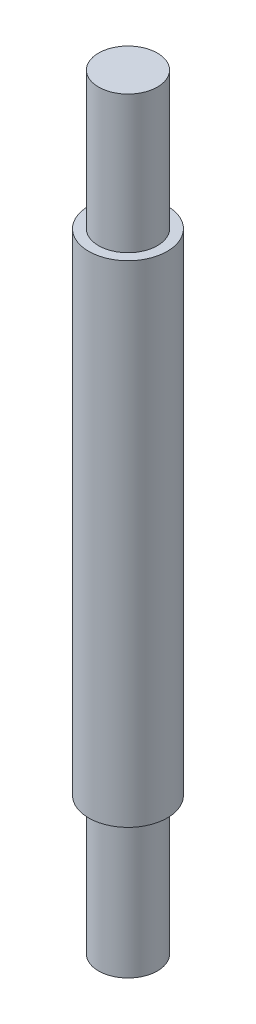
ISO-10303-21;
HEADER;
FILE_DESCRIPTION(('STEP AP214'),'2;1');
FILE_NAME('part.step','',(''),(''),'','','');
FILE_SCHEMA(('AUTOMOTIVE_DESIGN { 1 0 10303 214 1 1 1 1 }'));
ENDSEC;
DATA;
#1=APPLICATION_CONTEXT('core data for automotive mechanical design processes');
#2=APPLICATION_PROTOCOL_DEFINITION('international standard','automotive_design',2000,#1);
#3=PRODUCT_CONTEXT('',#1,'mechanical');
#4=PRODUCT('Part','Part','',(#3));
#5=PRODUCT_RELATED_PRODUCT_CATEGORY('part','',(#4));
#6=PRODUCT_DEFINITION_FORMATION('','',#4);
#7=PRODUCT_DEFINITION_CONTEXT('part definition',#1,'design');
#8=PRODUCT_DEFINITION('design','',#6,#7);
#9=PRODUCT_DEFINITION_SHAPE('','',#8);
#10=(LENGTH_UNIT() NAMED_UNIT(*) SI_UNIT(.MILLI.,.METRE.));
#11=(NAMED_UNIT(*) PLANE_ANGLE_UNIT() SI_UNIT($,.RADIAN.));
#12=(NAMED_UNIT(*) SI_UNIT($,.STERADIAN.) SOLID_ANGLE_UNIT());
#13=UNCERTAINTY_MEASURE_WITH_UNIT(LENGTH_MEASURE(1.E-05),#10,'distance_accuracy_value','');
#14=(GEOMETRIC_REPRESENTATION_CONTEXT(3) GLOBAL_UNCERTAINTY_ASSIGNED_CONTEXT((#13)) GLOBAL_UNIT_ASSIGNED_CONTEXT((#10,
#11,#12)) REPRESENTATION_CONTEXT('',''));
#15=CARTESIAN_POINT('',(0.,0.,0.));
#16=DIRECTION('',(0.,0.,1.));
#17=DIRECTION('',(1.,0.,0.));
#18=AXIS2_PLACEMENT_3D('',#15,#16,#17);
#19=CARTESIAN_POINT('',(0.,0.,0.));
#20=DIRECTION('',(0.,1.,0.));
#21=DIRECTION('',(0.,0.,1.));
#22=AXIS2_PLACEMENT_3D('',#19,#20,#21);
#23=PLANE('',#22);
#24=CARTESIAN_POINT('',(0.,0.,0.));
#25=DIRECTION('',(0.,1.,0.));
#26=DIRECTION('',(0.,0.,1.));
#27=AXIS2_PLACEMENT_3D('',#24,#25,#26);
#28=CIRCLE('',#27,2.);
#29=CARTESIAN_POINT('',(0.,0.,2.));
#30=VERTEX_POINT('',#29);
#31=EDGE_CURVE('E42',#30,#30,#28,.T.);
#32=ORIENTED_EDGE('',*,*,#31,.F.);
#33=EDGE_LOOP('',(#32));
#34=FACE_BOUND('',#33,.T.);
#35=CARTESIAN_POINT('',(0.,0.,0.));
#36=DIRECTION('',(0.,1.,0.));
#37=DIRECTION('',(0.,0.,1.));
#38=AXIS2_PLACEMENT_3D('',#35,#36,#37);
#39=CIRCLE('',#38,1.5);
#40=CARTESIAN_POINT('',(0.,0.,1.5));
#41=VERTEX_POINT('',#40);
#42=EDGE_CURVE('E10',#41,#41,#39,.F.);
#43=ORIENTED_EDGE('',*,*,#42,.F.);
#44=EDGE_LOOP('',(#43));
#45=FACE_BOUND('',#44,.T.);
#46=ADVANCED_FACE('F31',(#34,#45),#23,.F.);
#47=CARTESIAN_POINT('',(0.,25.,0.));
#48=DIRECTION('',(0.,1.,0.));
#49=DIRECTION('',(0.,0.,1.));
#50=AXIS2_PLACEMENT_3D('',#47,#48,#49);
#51=PLANE('',#50);
#52=CARTESIAN_POINT('',(0.,25.,0.));
#53=DIRECTION('',(0.,1.,0.));
#54=DIRECTION('',(0.,0.,1.));
#55=AXIS2_PLACEMENT_3D('',#52,#53,#54);
#56=CIRCLE('',#55,2.);
#57=CARTESIAN_POINT('',(0.,25.,2.));
#58=VERTEX_POINT('',#57);
#59=EDGE_CURVE('E38',#58,#58,#56,.T.);
#60=ORIENTED_EDGE('',*,*,#59,.T.);
#61=EDGE_LOOP('',(#60));
#62=FACE_BOUND('',#61,.T.);
#63=CARTESIAN_POINT('',(0.,25.,0.));
#64=DIRECTION('',(0.,1.,0.));
#65=DIRECTION('',(0.,0.,1.));
#66=AXIS2_PLACEMENT_3D('',#63,#64,#65);
#67=CIRCLE('',#66,1.5);
#68=CARTESIAN_POINT('',(0.,25.,1.5));
#69=VERTEX_POINT('',#68);
#70=EDGE_CURVE('E49',#69,#69,#67,.T.);
#71=ORIENTED_EDGE('',*,*,#70,.F.);
#72=EDGE_LOOP('',(#71));
#73=FACE_BOUND('',#72,.T.);
#74=ADVANCED_FACE('F73',(#62,#73),#51,.T.);
#75=CARTESIAN_POINT('',(0.,25.,0.));
#76=DIRECTION('',(0.,-1.,0.));
#77=DIRECTION('',(0.,0.,-1.));
#78=AXIS2_PLACEMENT_3D('',#75,#76,#77);
#79=CYLINDRICAL_SURFACE('',#78,2.);
#80=ORIENTED_EDGE('',*,*,#59,.F.);
#81=EDGE_LOOP('',(#80));
#82=FACE_BOUND('',#81,.T.);
#83=ORIENTED_EDGE('',*,*,#31,.T.);
#84=EDGE_LOOP('',(#83));
#85=FACE_BOUND('',#84,.T.);
#86=ADVANCED_FACE('F33',(#82,#85),#79,.T.);
#87=CARTESIAN_POINT('',(0.,32.,0.));
#88=DIRECTION('',(0.,-1.,0.));
#89=DIRECTION('',(0.,0.,-1.));
#90=AXIS2_PLACEMENT_3D('',#87,#88,#89);
#91=CYLINDRICAL_SURFACE('',#90,1.5);
#92=CARTESIAN_POINT('',(0.,32.,0.));
#93=DIRECTION('',(0.,1.,0.));
#94=DIRECTION('',(0.,0.,1.));
#95=AXIS2_PLACEMENT_3D('',#92,#93,#94);
#96=CIRCLE('',#95,1.5);
#97=CARTESIAN_POINT('',(0.,32.,1.5));
#98=VERTEX_POINT('',#97);
#99=EDGE_CURVE('E47',#98,#98,#96,.T.);
#100=ORIENTED_EDGE('',*,*,#99,.F.);
#101=EDGE_LOOP('',(#100));
#102=FACE_BOUND('',#101,.T.);
#103=ORIENTED_EDGE('',*,*,#70,.T.);
#104=EDGE_LOOP('',(#103));
#105=FACE_BOUND('',#104,.T.);
#106=ADVANCED_FACE('F69',(#102,#105),#91,.T.);
#107=CARTESIAN_POINT('',(0.,32.,0.));
#108=DIRECTION('',(0.,1.,0.));
#109=DIRECTION('',(0.,0.,1.));
#110=AXIS2_PLACEMENT_3D('',#107,#108,#109);
#111=PLANE('',#110);
#112=ORIENTED_EDGE('',*,*,#99,.T.);
#113=EDGE_LOOP('',(#112));
#114=FACE_BOUND('',#113,.T.);
#115=ADVANCED_FACE('F62',(#114),#111,.T.);
#116=CARTESIAN_POINT('',(0.,-7.,0.));
#117=DIRECTION('',(0.,1.,0.));
#118=DIRECTION('',(0.,0.,1.));
#119=AXIS2_PLACEMENT_3D('',#116,#117,#118);
#120=CYLINDRICAL_SURFACE('',#119,1.5);
#121=CARTESIAN_POINT('',(0.,-7.,0.));
#122=DIRECTION('',(0.,-1.,0.));
#123=DIRECTION('',(0.,0.,-1.));
#124=AXIS2_PLACEMENT_3D('',#121,#122,#123);
#125=CIRCLE('',#124,1.5);
#126=CARTESIAN_POINT('',(0.,-7.,-1.5));
#127=VERTEX_POINT('',#126);
#128=EDGE_CURVE('E52',#127,#127,#125,.T.);
#129=ORIENTED_EDGE('',*,*,#128,.F.);
#130=EDGE_LOOP('',(#129));
#131=FACE_BOUND('',#130,.T.);
#132=ORIENTED_EDGE('',*,*,#42,.T.);
#133=EDGE_LOOP('',(#132));
#134=FACE_BOUND('',#133,.T.);
#135=ADVANCED_FACE('F60',(#131,#134),#120,.T.);
#136=CARTESIAN_POINT('',(0.,-7.,0.));
#137=DIRECTION('',(0.,-1.,0.));
#138=DIRECTION('',(0.,0.,-1.));
#139=AXIS2_PLACEMENT_3D('',#136,#137,#138);
#140=PLANE('',#139);
#141=ORIENTED_EDGE('',*,*,#128,.T.);
#142=EDGE_LOOP('',(#141));
#143=FACE_BOUND('',#142,.T.);
#144=ADVANCED_FACE('F58',(#143),#140,.T.);
#145=CLOSED_SHELL('',(#46,#74,#86,#106,#115,#135,#144));
#146=MANIFOLD_SOLID_BREP('B2',#145);
#147=ADVANCED_BREP_SHAPE_REPRESENTATION('',(#18,#146),#14);
#148=SHAPE_DEFINITION_REPRESENTATION(#9,#147);
ENDSEC;
END-ISO-10303-21;
